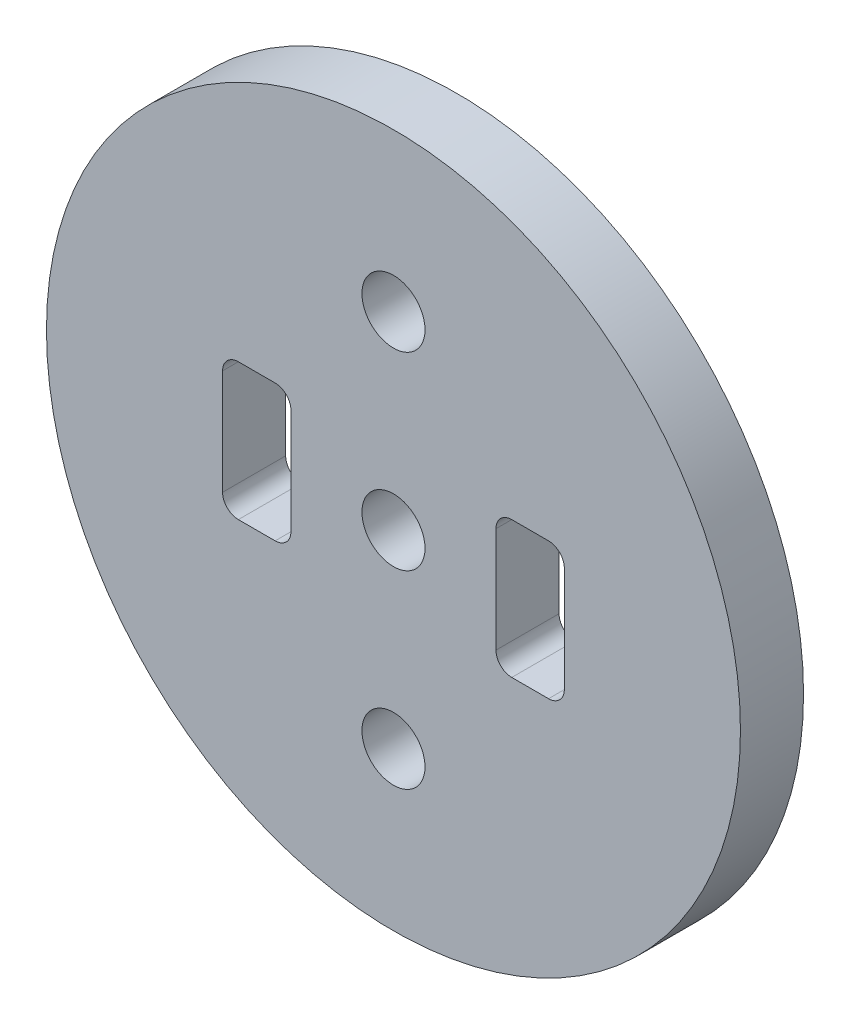
ISO-10303-21;
HEADER;
FILE_DESCRIPTION(('STEP AP214'),'2;1');
FILE_NAME('part.step','',(''),(''),'','','');
FILE_SCHEMA(('AUTOMOTIVE_DESIGN { 1 0 10303 214 1 1 1 1 }'));
ENDSEC;
DATA;
#1=APPLICATION_CONTEXT('core data for automotive mechanical design processes');
#2=APPLICATION_PROTOCOL_DEFINITION('international standard','automotive_design',2000,#1);
#3=PRODUCT_CONTEXT('',#1,'mechanical');
#4=PRODUCT('Part','Part','',(#3));
#5=PRODUCT_RELATED_PRODUCT_CATEGORY('part','',(#4));
#6=PRODUCT_DEFINITION_FORMATION('','',#4);
#7=PRODUCT_DEFINITION_CONTEXT('part definition',#1,'design');
#8=PRODUCT_DEFINITION('design','',#6,#7);
#9=PRODUCT_DEFINITION_SHAPE('','',#8);
#10=(LENGTH_UNIT() NAMED_UNIT(*) SI_UNIT(.MILLI.,.METRE.));
#11=(NAMED_UNIT(*) PLANE_ANGLE_UNIT() SI_UNIT($,.RADIAN.));
#12=(NAMED_UNIT(*) SI_UNIT($,.STERADIAN.) SOLID_ANGLE_UNIT());
#13=UNCERTAINTY_MEASURE_WITH_UNIT(LENGTH_MEASURE(1.E-05),#10,'distance_accuracy_value','');
#14=(GEOMETRIC_REPRESENTATION_CONTEXT(3) GLOBAL_UNCERTAINTY_ASSIGNED_CONTEXT((#13)) GLOBAL_UNIT_ASSIGNED_CONTEXT((#10,
#11,#12)) REPRESENTATION_CONTEXT('',''));
#15=CARTESIAN_POINT('',(0.,0.,0.));
#16=DIRECTION('',(0.,0.,1.));
#17=DIRECTION('',(1.,0.,0.));
#18=AXIS2_PLACEMENT_3D('',#15,#16,#17);
#19=CARTESIAN_POINT('',(215.7478079135,241.9520199932,3.));
#20=DIRECTION('',(0.,0.,1.));
#21=DIRECTION('',(1.,0.,0.));
#22=AXIS2_PLACEMENT_3D('',#19,#20,#21);
#23=PLANE('',#22);
#24=DIRECTION('',(0.,-1.,0.));
#25=VECTOR('',#24,1.);
#26=CARTESIAN_POINT('',(220.6228079135,244.4520199932,3.));
#27=LINE('',#26,#25);
#28=CARTESIAN_POINT('',(220.6228079135,244.4520199932,3.));
#29=VERTEX_POINT('',#28);
#30=CARTESIAN_POINT('',(220.6228079135,239.4520199932,3.));
#31=VERTEX_POINT('',#30);
#32=EDGE_CURVE('E213',#29,#31,#27,.T.);
#33=ORIENTED_EDGE('',*,*,#32,.F.);
#34=CARTESIAN_POINT('',(221.3728079135,244.4520199932,3.));
#35=DIRECTION('',(0.,0.,1.));
#36=DIRECTION('',(1.,0.,0.));
#37=AXIS2_PLACEMENT_3D('',#34,#35,#36);
#38=CIRCLE('',#37,0.750000000000001);
#39=CARTESIAN_POINT('',(221.3728079135,245.2020199932,3.));
#40=VERTEX_POINT('',#39);
#41=EDGE_CURVE('E211',#40,#29,#38,.T.);
#42=ORIENTED_EDGE('',*,*,#41,.F.);
#43=DIRECTION('',(-1.,0.,0.));
#44=VECTOR('',#43,1.);
#45=CARTESIAN_POINT('',(223.1228079135,245.2020199932,3.));
#46=LINE('',#45,#44);
#47=CARTESIAN_POINT('',(223.1228079135,245.2020199932,3.));
#48=VERTEX_POINT('',#47);
#49=EDGE_CURVE('E227',#48,#40,#46,.T.);
#50=ORIENTED_EDGE('',*,*,#49,.F.);
#51=CARTESIAN_POINT('',(223.1228079135,244.4520199932,3.));
#52=DIRECTION('',(0.,0.,1.));
#53=DIRECTION('',(1.,0.,0.));
#54=AXIS2_PLACEMENT_3D('',#51,#52,#53);
#55=CIRCLE('',#54,0.750000000000001);
#56=CARTESIAN_POINT('',(223.8728079135,244.4520199932,3.));
#57=VERTEX_POINT('',#56);
#58=EDGE_CURVE('E224',#57,#48,#55,.T.);
#59=ORIENTED_EDGE('',*,*,#58,.F.);
#60=DIRECTION('',(0.,1.,0.));
#61=VECTOR('',#60,1.);
#62=CARTESIAN_POINT('',(223.8728079135,239.4520199932,3.));
#63=LINE('',#62,#61);
#64=CARTESIAN_POINT('',(223.8728079135,239.4520199932,3.));
#65=VERTEX_POINT('',#64);
#66=EDGE_CURVE('E222',#65,#57,#63,.T.);
#67=ORIENTED_EDGE('',*,*,#66,.F.);
#68=CARTESIAN_POINT('',(223.1228079135,239.4520199932,3.));
#69=DIRECTION('',(0.,0.,1.));
#70=DIRECTION('',(1.,0.,0.));
#71=AXIS2_PLACEMENT_3D('',#68,#69,#70);
#72=CIRCLE('',#71,0.750000000000001);
#73=CARTESIAN_POINT('',(223.1228079135,238.7020199932,3.));
#74=VERTEX_POINT('',#73);
#75=EDGE_CURVE('E220',#74,#65,#72,.T.);
#76=ORIENTED_EDGE('',*,*,#75,.F.);
#77=DIRECTION('',(1.,0.,0.));
#78=VECTOR('',#77,1.);
#79=CARTESIAN_POINT('',(221.3728079135,238.7020199932,3.));
#80=LINE('',#79,#78);
#81=CARTESIAN_POINT('',(221.3728079135,238.7020199932,3.));
#82=VERTEX_POINT('',#81);
#83=EDGE_CURVE('E218',#82,#74,#80,.T.);
#84=ORIENTED_EDGE('',*,*,#83,.F.);
#85=CARTESIAN_POINT('',(221.3728079135,239.4520199932,3.));
#86=DIRECTION('',(0.,0.,1.));
#87=DIRECTION('',(1.,0.,0.));
#88=AXIS2_PLACEMENT_3D('',#85,#86,#87);
#89=CIRCLE('',#88,0.750000000000001);
#90=EDGE_CURVE('E216',#31,#82,#89,.T.);
#91=ORIENTED_EDGE('',*,*,#90,.F.);
#92=EDGE_LOOP('',(#33,#42,#50,#59,#67,#76,#84,#91));
#93=FACE_BOUND('',#92,.T.);
#94=CARTESIAN_POINT('',(215.7478079135,232.9520199932,3.));
#95=DIRECTION('',(0.,0.,1.));
#96=DIRECTION('',(1.,0.,0.));
#97=AXIS2_PLACEMENT_3D('',#94,#95,#96);
#98=CIRCLE('',#97,1.5);
#99=CARTESIAN_POINT('',(217.2478079135,232.9520199932,3.));
#100=VERTEX_POINT('',#99);
#101=EDGE_CURVE('E276',#100,#100,#98,.T.);
#102=ORIENTED_EDGE('',*,*,#101,.F.);
#103=EDGE_LOOP('',(#102));
#104=FACE_BOUND('',#103,.T.);
#105=CARTESIAN_POINT('',(215.7478079135,241.9520199932,3.));
#106=DIRECTION('',(0.,0.,1.));
#107=DIRECTION('',(1.,0.,0.));
#108=AXIS2_PLACEMENT_3D('',#105,#106,#107);
#109=CIRCLE('',#108,16.5);
#110=CARTESIAN_POINT('',(232.2478079135,241.9520199932,3.));
#111=VERTEX_POINT('',#110);
#112=EDGE_CURVE('E11',#111,#111,#109,.T.);
#113=ORIENTED_EDGE('',*,*,#112,.T.);
#114=EDGE_LOOP('',(#113));
#115=FACE_BOUND('',#114,.T.);
#116=CARTESIAN_POINT('',(215.7478079135,241.9520199932,3.));
#117=DIRECTION('',(0.,0.,1.));
#118=DIRECTION('',(1.,0.,0.));
#119=AXIS2_PLACEMENT_3D('',#116,#117,#118);
#120=CIRCLE('',#119,1.5);
#121=CARTESIAN_POINT('',(217.2478079135,241.9520199932,3.));
#122=VERTEX_POINT('',#121);
#123=EDGE_CURVE('E282',#122,#122,#120,.T.);
#124=ORIENTED_EDGE('',*,*,#123,.F.);
#125=EDGE_LOOP('',(#124));
#126=FACE_BOUND('',#125,.T.);
#127=CARTESIAN_POINT('',(215.7478079135,250.9520199932,3.));
#128=DIRECTION('',(0.,0.,1.));
#129=DIRECTION('',(1.,0.,0.));
#130=AXIS2_PLACEMENT_3D('',#127,#128,#129);
#131=CIRCLE('',#130,1.5);
#132=CARTESIAN_POINT('',(217.2478079135,250.9520199932,3.));
#133=VERTEX_POINT('',#132);
#134=EDGE_CURVE('E270',#133,#133,#131,.T.);
#135=ORIENTED_EDGE('',*,*,#134,.F.);
#136=EDGE_LOOP('',(#135));
#137=FACE_BOUND('',#136,.T.);
#138=DIRECTION('',(-1.,0.,0.));
#139=VECTOR('',#138,1.);
#140=CARTESIAN_POINT('',(208.3728079135,245.2020199932,3.));
#141=LINE('',#140,#139);
#142=CARTESIAN_POINT('',(210.1228079135,245.2020199932,3.));
#143=VERTEX_POINT('',#142);
#144=CARTESIAN_POINT('',(208.3728079135,245.2020199932,3.));
#145=VERTEX_POINT('',#144);
#146=EDGE_CURVE('E154',#143,#145,#141,.T.);
#147=ORIENTED_EDGE('',*,*,#146,.F.);
#148=CARTESIAN_POINT('',(210.1228079135,244.4520199932,3.));
#149=DIRECTION('',(0.,0.,1.));
#150=DIRECTION('',(1.,0.,0.));
#151=AXIS2_PLACEMENT_3D('',#148,#149,#150);
#152=CIRCLE('',#151,0.750000000000001);
#153=CARTESIAN_POINT('',(210.8728079135,244.4520199932,3.));
#154=VERTEX_POINT('',#153);
#155=EDGE_CURVE('E146',#154,#143,#152,.T.);
#156=ORIENTED_EDGE('',*,*,#155,.F.);
#157=DIRECTION('',(0.,1.,0.));
#158=VECTOR('',#157,1.);
#159=CARTESIAN_POINT('',(210.8728079135,244.4520199932,3.));
#160=LINE('',#159,#158);
#161=CARTESIAN_POINT('',(210.8728079135,239.4520199932,3.));
#162=VERTEX_POINT('',#161);
#163=EDGE_CURVE('E179',#162,#154,#160,.T.);
#164=ORIENTED_EDGE('',*,*,#163,.F.);
#165=CARTESIAN_POINT('',(210.1228079135,239.4520199932,3.));
#166=DIRECTION('',(0.,0.,1.));
#167=DIRECTION('',(1.,0.,0.));
#168=AXIS2_PLACEMENT_3D('',#165,#166,#167);
#169=CIRCLE('',#168,0.750000000000001);
#170=CARTESIAN_POINT('',(210.1228079135,238.7020199932,3.));
#171=VERTEX_POINT('',#170);
#172=EDGE_CURVE('E177',#171,#162,#169,.T.);
#173=ORIENTED_EDGE('',*,*,#172,.F.);
#174=DIRECTION('',(1.,0.,0.));
#175=VECTOR('',#174,1.);
#176=CARTESIAN_POINT('',(210.1228079135,238.7020199932,3.));
#177=LINE('',#176,#175);
#178=CARTESIAN_POINT('',(208.3728079135,238.7020199932,3.));
#179=VERTEX_POINT('',#178);
#180=EDGE_CURVE('E175',#179,#171,#177,.T.);
#181=ORIENTED_EDGE('',*,*,#180,.F.);
#182=CARTESIAN_POINT('',(208.3728079135,239.4520199932,3.));
#183=DIRECTION('',(0.,0.,1.));
#184=DIRECTION('',(1.,0.,0.));
#185=AXIS2_PLACEMENT_3D('',#182,#183,#184);
#186=CIRCLE('',#185,0.750000000000237);
#187=CARTESIAN_POINT('',(207.6228079135,239.4520199932,3.));
#188=VERTEX_POINT('',#187);
#189=EDGE_CURVE('E173',#188,#179,#186,.T.);
#190=ORIENTED_EDGE('',*,*,#189,.F.);
#191=DIRECTION('',(0.,-1.,0.));
#192=VECTOR('',#191,1.);
#193=CARTESIAN_POINT('',(207.6228079135,239.4520199932,3.));
#194=LINE('',#193,#192);
#195=CARTESIAN_POINT('',(207.6228079135,244.4520199932,3.));
#196=VERTEX_POINT('',#195);
#197=EDGE_CURVE('E169',#196,#188,#194,.T.);
#198=ORIENTED_EDGE('',*,*,#197,.F.);
#199=CARTESIAN_POINT('',(208.3728079135,244.4520199932,3.));
#200=DIRECTION('',(0.,0.,1.));
#201=DIRECTION('',(1.,0.,0.));
#202=AXIS2_PLACEMENT_3D('',#199,#200,#201);
#203=CIRCLE('',#202,0.750000000000001);
#204=EDGE_CURVE('E167',#145,#196,#203,.T.);
#205=ORIENTED_EDGE('',*,*,#204,.F.);
#206=EDGE_LOOP('',(#147,#156,#164,#173,#181,#190,#198,#205));
#207=FACE_BOUND('',#206,.T.);
#208=ADVANCED_FACE('F33',(#93,#104,#115,#126,#137,#207),#23,.T.);
#209=CARTESIAN_POINT('',(215.7478079135,241.9520199932,0.));
#210=DIRECTION('',(0.,0.,1.));
#211=DIRECTION('',(1.,0.,0.));
#212=AXIS2_PLACEMENT_3D('',#209,#210,#211);
#213=PLANE('',#212);
#214=CARTESIAN_POINT('',(221.3728079135,244.4520199932,0.));
#215=DIRECTION('',(0.,0.,1.));
#216=DIRECTION('',(1.,0.,0.));
#217=AXIS2_PLACEMENT_3D('',#214,#215,#216);
#218=CIRCLE('',#217,0.750000000000001);
#219=CARTESIAN_POINT('',(221.3728079135,245.2020199932,0.));
#220=VERTEX_POINT('',#219);
#221=CARTESIAN_POINT('',(220.6228079135,244.4520199932,0.));
#222=VERTEX_POINT('',#221);
#223=EDGE_CURVE('E162',#220,#222,#218,.T.);
#224=ORIENTED_EDGE('',*,*,#223,.T.);
#225=DIRECTION('',(0.,-1.,0.));
#226=VECTOR('',#225,1.);
#227=CARTESIAN_POINT('',(220.6228079135,244.4520199932,0.));
#228=LINE('',#227,#226);
#229=CARTESIAN_POINT('',(220.6228079135,239.4520199932,0.));
#230=VERTEX_POINT('',#229);
#231=EDGE_CURVE('E232',#222,#230,#228,.T.);
#232=ORIENTED_EDGE('',*,*,#231,.T.);
#233=CARTESIAN_POINT('',(221.3728079135,239.4520199932,0.));
#234=DIRECTION('',(0.,0.,1.));
#235=DIRECTION('',(1.,0.,0.));
#236=AXIS2_PLACEMENT_3D('',#233,#234,#235);
#237=CIRCLE('',#236,0.750000000000001);
#238=CARTESIAN_POINT('',(221.3728079135,238.7020199932,0.));
#239=VERTEX_POINT('',#238);
#240=EDGE_CURVE('E235',#230,#239,#237,.T.);
#241=ORIENTED_EDGE('',*,*,#240,.T.);
#242=DIRECTION('',(1.,0.,0.));
#243=VECTOR('',#242,1.);
#244=CARTESIAN_POINT('',(221.3728079135,238.7020199932,0.));
#245=LINE('',#244,#243);
#246=CARTESIAN_POINT('',(223.1228079135,238.7020199932,0.));
#247=VERTEX_POINT('',#246);
#248=EDGE_CURVE('E238',#239,#247,#245,.T.);
#249=ORIENTED_EDGE('',*,*,#248,.T.);
#250=CARTESIAN_POINT('',(223.1228079135,239.4520199932,0.));
#251=DIRECTION('',(0.,0.,1.));
#252=DIRECTION('',(1.,0.,0.));
#253=AXIS2_PLACEMENT_3D('',#250,#251,#252);
#254=CIRCLE('',#253,0.750000000000001);
#255=CARTESIAN_POINT('',(223.8728079135,239.4520199932,0.));
#256=VERTEX_POINT('',#255);
#257=EDGE_CURVE('E241',#247,#256,#254,.T.);
#258=ORIENTED_EDGE('',*,*,#257,.T.);
#259=DIRECTION('',(0.,1.,0.));
#260=VECTOR('',#259,1.);
#261=CARTESIAN_POINT('',(223.8728079135,239.4520199932,0.));
#262=LINE('',#261,#260);
#263=CARTESIAN_POINT('',(223.8728079135,244.4520199932,0.));
#264=VERTEX_POINT('',#263);
#265=EDGE_CURVE('E244',#256,#264,#262,.T.);
#266=ORIENTED_EDGE('',*,*,#265,.T.);
#267=CARTESIAN_POINT('',(223.1228079135,244.4520199932,0.));
#268=DIRECTION('',(0.,0.,1.));
#269=DIRECTION('',(1.,0.,0.));
#270=AXIS2_PLACEMENT_3D('',#267,#268,#269);
#271=CIRCLE('',#270,0.750000000000001);
#272=CARTESIAN_POINT('',(223.1228079135,245.2020199932,0.));
#273=VERTEX_POINT('',#272);
#274=EDGE_CURVE('E247',#264,#273,#271,.T.);
#275=ORIENTED_EDGE('',*,*,#274,.T.);
#276=DIRECTION('',(-1.,0.,0.));
#277=VECTOR('',#276,1.);
#278=CARTESIAN_POINT('',(223.1228079135,245.2020199932,0.));
#279=LINE('',#278,#277);
#280=EDGE_CURVE('E214',#273,#220,#279,.T.);
#281=ORIENTED_EDGE('',*,*,#280,.T.);
#282=EDGE_LOOP('',(#224,#232,#241,#249,#258,#266,#275,#281));
#283=FACE_BOUND('',#282,.T.);
#284=CARTESIAN_POINT('',(215.7478079135,232.9520199932,0.));
#285=DIRECTION('',(0.,0.,1.));
#286=DIRECTION('',(1.,0.,0.));
#287=AXIS2_PLACEMENT_3D('',#284,#285,#286);
#288=CIRCLE('',#287,1.5);
#289=CARTESIAN_POINT('',(217.2478079135,232.9520199932,0.));
#290=VERTEX_POINT('',#289);
#291=EDGE_CURVE('E273',#290,#290,#288,.T.);
#292=ORIENTED_EDGE('',*,*,#291,.T.);
#293=EDGE_LOOP('',(#292));
#294=FACE_BOUND('',#293,.T.);
#295=CARTESIAN_POINT('',(215.7478079135,241.9520199932,0.));
#296=DIRECTION('',(0.,0.,1.));
#297=DIRECTION('',(1.,0.,0.));
#298=AXIS2_PLACEMENT_3D('',#295,#296,#297);
#299=CIRCLE('',#298,16.5);
#300=CARTESIAN_POINT('',(232.2478079135,241.9520199932,0.));
#301=VERTEX_POINT('',#300);
#302=EDGE_CURVE('E37',#301,#301,#299,.T.);
#303=ORIENTED_EDGE('',*,*,#302,.F.);
#304=EDGE_LOOP('',(#303));
#305=FACE_BOUND('',#304,.T.);
#306=CARTESIAN_POINT('',(215.7478079135,241.9520199932,0.));
#307=DIRECTION('',(0.,0.,1.));
#308=DIRECTION('',(1.,0.,0.));
#309=AXIS2_PLACEMENT_3D('',#306,#307,#308);
#310=CIRCLE('',#309,1.5);
#311=CARTESIAN_POINT('',(217.2478079135,241.9520199932,0.));
#312=VERTEX_POINT('',#311);
#313=EDGE_CURVE('E279',#312,#312,#310,.T.);
#314=ORIENTED_EDGE('',*,*,#313,.T.);
#315=EDGE_LOOP('',(#314));
#316=FACE_BOUND('',#315,.T.);
#317=CARTESIAN_POINT('',(215.7478079135,250.9520199932,0.));
#318=DIRECTION('',(0.,0.,1.));
#319=DIRECTION('',(1.,0.,0.));
#320=AXIS2_PLACEMENT_3D('',#317,#318,#319);
#321=CIRCLE('',#320,1.5);
#322=CARTESIAN_POINT('',(217.2478079135,250.9520199932,0.));
#323=VERTEX_POINT('',#322);
#324=EDGE_CURVE('E269',#323,#323,#321,.T.);
#325=ORIENTED_EDGE('',*,*,#324,.T.);
#326=EDGE_LOOP('',(#325));
#327=FACE_BOUND('',#326,.T.);
#328=CARTESIAN_POINT('',(210.1228079135,244.4520199932,0.));
#329=DIRECTION('',(0.,0.,1.));
#330=DIRECTION('',(1.,0.,0.));
#331=AXIS2_PLACEMENT_3D('',#328,#329,#330);
#332=CIRCLE('',#331,0.750000000000001);
#333=CARTESIAN_POINT('',(210.8728079135,244.4520199932,0.));
#334=VERTEX_POINT('',#333);
#335=CARTESIAN_POINT('',(210.1228079135,245.2020199932,0.));
#336=VERTEX_POINT('',#335);
#337=EDGE_CURVE('E56',#334,#336,#332,.T.);
#338=ORIENTED_EDGE('',*,*,#337,.T.);
#339=DIRECTION('',(-1.,0.,0.));
#340=VECTOR('',#339,1.);
#341=CARTESIAN_POINT('',(208.3728079135,245.2020199932,0.));
#342=LINE('',#341,#340);
#343=CARTESIAN_POINT('',(208.3728079135,245.2020199932,0.));
#344=VERTEX_POINT('',#343);
#345=EDGE_CURVE('E161',#336,#344,#342,.T.);
#346=ORIENTED_EDGE('',*,*,#345,.T.);
#347=CARTESIAN_POINT('',(208.3728079135,244.4520199932,0.));
#348=DIRECTION('',(0.,0.,1.));
#349=DIRECTION('',(1.,0.,0.));
#350=AXIS2_PLACEMENT_3D('',#347,#348,#349);
#351=CIRCLE('',#350,0.750000000000001);
#352=CARTESIAN_POINT('',(207.6228079135,244.4520199932,0.));
#353=VERTEX_POINT('',#352);
#354=EDGE_CURVE('E183',#344,#353,#351,.T.);
#355=ORIENTED_EDGE('',*,*,#354,.T.);
#356=DIRECTION('',(0.,-1.,0.));
#357=VECTOR('',#356,1.);
#358=CARTESIAN_POINT('',(207.6228079135,239.4520199932,0.));
#359=LINE('',#358,#357);
#360=CARTESIAN_POINT('',(207.6228079135,239.4520199932,0.));
#361=VERTEX_POINT('',#360);
#362=EDGE_CURVE('E186',#353,#361,#359,.T.);
#363=ORIENTED_EDGE('',*,*,#362,.T.);
#364=CARTESIAN_POINT('',(208.3728079135,239.4520199932,0.));
#365=DIRECTION('',(0.,0.,1.));
#366=DIRECTION('',(1.,0.,0.));
#367=AXIS2_PLACEMENT_3D('',#364,#365,#366);
#368=CIRCLE('',#367,0.750000000000237);
#369=CARTESIAN_POINT('',(208.3728079135,238.7020199932,0.));
#370=VERTEX_POINT('',#369);
#371=EDGE_CURVE('E189',#361,#370,#368,.T.);
#372=ORIENTED_EDGE('',*,*,#371,.T.);
#373=DIRECTION('',(1.,0.,0.));
#374=VECTOR('',#373,1.);
#375=CARTESIAN_POINT('',(210.1228079135,238.7020199932,0.));
#376=LINE('',#375,#374);
#377=CARTESIAN_POINT('',(210.1228079135,238.7020199932,0.));
#378=VERTEX_POINT('',#377);
#379=EDGE_CURVE('E192',#370,#378,#376,.T.);
#380=ORIENTED_EDGE('',*,*,#379,.T.);
#381=CARTESIAN_POINT('',(210.1228079135,239.4520199932,0.));
#382=DIRECTION('',(0.,0.,1.));
#383=DIRECTION('',(1.,0.,0.));
#384=AXIS2_PLACEMENT_3D('',#381,#382,#383);
#385=CIRCLE('',#384,0.750000000000001);
#386=CARTESIAN_POINT('',(210.8728079135,239.4520199932,0.));
#387=VERTEX_POINT('',#386);
#388=EDGE_CURVE('E195',#378,#387,#385,.T.);
#389=ORIENTED_EDGE('',*,*,#388,.T.);
#390=DIRECTION('',(0.,1.,0.));
#391=VECTOR('',#390,1.);
#392=CARTESIAN_POINT('',(210.8728079135,244.4520199932,0.));
#393=LINE('',#392,#391);
#394=EDGE_CURVE('E155',#387,#334,#393,.T.);
#395=ORIENTED_EDGE('',*,*,#394,.T.);
#396=EDGE_LOOP('',(#338,#346,#355,#363,#372,#380,#389,#395));
#397=FACE_BOUND('',#396,.T.);
#398=ADVANCED_FACE('F288',(#283,#294,#305,#316,#327,#397),#213,.F.);
#399=CARTESIAN_POINT('',(215.7478079135,241.9520199932,3.));
#400=DIRECTION('',(0.,0.,-1.));
#401=DIRECTION('',(-1.,0.,0.));
#402=AXIS2_PLACEMENT_3D('',#399,#400,#401);
#403=CYLINDRICAL_SURFACE('',#402,16.5);
#404=ORIENTED_EDGE('',*,*,#112,.F.);
#405=EDGE_LOOP('',(#404));
#406=FACE_BOUND('',#405,.T.);
#407=ORIENTED_EDGE('',*,*,#302,.T.);
#408=EDGE_LOOP('',(#407));
#409=FACE_BOUND('',#408,.T.);
#410=ADVANCED_FACE('F35',(#406,#409),#403,.T.);
#411=CARTESIAN_POINT('',(215.7478079135,241.9520199932,3.));
#412=DIRECTION('',(0.,0.,-1.));
#413=DIRECTION('',(-1.,0.,0.));
#414=AXIS2_PLACEMENT_3D('',#411,#412,#413);
#415=CYLINDRICAL_SURFACE('',#414,1.5);
#416=ORIENTED_EDGE('',*,*,#123,.T.);
#417=EDGE_LOOP('',(#416));
#418=FACE_BOUND('',#417,.T.);
#419=ORIENTED_EDGE('',*,*,#313,.F.);
#420=EDGE_LOOP('',(#419));
#421=FACE_BOUND('',#420,.T.);
#422=ADVANCED_FACE('F291',(#418,#421),#415,.F.);
#423=CARTESIAN_POINT('',(215.7478079135,232.9520199932,3.));
#424=DIRECTION('',(0.,0.,-1.));
#425=DIRECTION('',(-1.,0.,0.));
#426=AXIS2_PLACEMENT_3D('',#423,#424,#425);
#427=CYLINDRICAL_SURFACE('',#426,1.5);
#428=ORIENTED_EDGE('',*,*,#101,.T.);
#429=EDGE_LOOP('',(#428));
#430=FACE_BOUND('',#429,.T.);
#431=ORIENTED_EDGE('',*,*,#291,.F.);
#432=EDGE_LOOP('',(#431));
#433=FACE_BOUND('',#432,.T.);
#434=ADVANCED_FACE('F293',(#430,#433),#427,.F.);
#435=CARTESIAN_POINT('',(215.7478079135,250.9520199932,3.));
#436=DIRECTION('',(0.,0.,-1.));
#437=DIRECTION('',(-1.,0.,0.));
#438=AXIS2_PLACEMENT_3D('',#435,#436,#437);
#439=CYLINDRICAL_SURFACE('',#438,1.5);
#440=ORIENTED_EDGE('',*,*,#134,.T.);
#441=EDGE_LOOP('',(#440));
#442=FACE_BOUND('',#441,.T.);
#443=ORIENTED_EDGE('',*,*,#324,.F.);
#444=EDGE_LOOP('',(#443));
#445=FACE_BOUND('',#444,.T.);
#446=ADVANCED_FACE('F300',(#442,#445),#439,.F.);
#447=CARTESIAN_POINT('',(221.3728079135,244.4520199932,3.));
#448=DIRECTION('',(0.,0.,-1.));
#449=DIRECTION('',(-1.,0.,0.));
#450=AXIS2_PLACEMENT_3D('',#447,#448,#449);
#451=CYLINDRICAL_SURFACE('',#450,0.750000000000001);
#452=ORIENTED_EDGE('',*,*,#223,.F.);
#453=DIRECTION('',(0.,0.,-1.));
#454=VECTOR('',#453,1.);
#455=CARTESIAN_POINT('',(221.3728079135,245.2020199932,3.));
#456=LINE('',#455,#454);
#457=EDGE_CURVE('E229',#40,#220,#456,.T.);
#458=ORIENTED_EDGE('',*,*,#457,.F.);
#459=ORIENTED_EDGE('',*,*,#41,.T.);
#460=DIRECTION('',(0.,0.,-1.));
#461=VECTOR('',#460,1.);
#462=CARTESIAN_POINT('',(220.6228079135,244.4520199932,3.));
#463=LINE('',#462,#461);
#464=EDGE_CURVE('E266',#29,#222,#463,.T.);
#465=ORIENTED_EDGE('',*,*,#464,.T.);
#466=EDGE_LOOP('',(#452,#458,#459,#465));
#467=FACE_BOUND('',#466,.T.);
#468=ADVANCED_FACE('F325',(#467),#451,.F.);
#469=CARTESIAN_POINT('',(220.6228079135,244.4520199932,3.));
#470=DIRECTION('',(1.,0.,0.));
#471=DIRECTION('',(0.,0.,-1.));
#472=AXIS2_PLACEMENT_3D('',#469,#470,#471);
#473=PLANE('',#472);
#474=ORIENTED_EDGE('',*,*,#231,.F.);
#475=ORIENTED_EDGE('',*,*,#464,.F.);
#476=ORIENTED_EDGE('',*,*,#32,.T.);
#477=DIRECTION('',(0.,0.,-1.));
#478=VECTOR('',#477,1.);
#479=CARTESIAN_POINT('',(220.6228079135,239.4520199932,3.));
#480=LINE('',#479,#478);
#481=EDGE_CURVE('E264',#31,#230,#480,.T.);
#482=ORIENTED_EDGE('',*,*,#481,.T.);
#483=EDGE_LOOP('',(#474,#475,#476,#482));
#484=FACE_BOUND('',#483,.T.);
#485=ADVANCED_FACE('F387',(#484),#473,.T.);
#486=CARTESIAN_POINT('',(221.3728079135,239.4520199932,3.));
#487=DIRECTION('',(0.,0.,-1.));
#488=DIRECTION('',(-1.,0.,0.));
#489=AXIS2_PLACEMENT_3D('',#486,#487,#488);
#490=CYLINDRICAL_SURFACE('',#489,0.750000000000001);
#491=ORIENTED_EDGE('',*,*,#240,.F.);
#492=ORIENTED_EDGE('',*,*,#481,.F.);
#493=ORIENTED_EDGE('',*,*,#90,.T.);
#494=DIRECTION('',(0.,0.,-1.));
#495=VECTOR('',#494,1.);
#496=CARTESIAN_POINT('',(221.3728079135,238.7020199932,3.));
#497=LINE('',#496,#495);
#498=EDGE_CURVE('E262',#82,#239,#497,.T.);
#499=ORIENTED_EDGE('',*,*,#498,.T.);
#500=EDGE_LOOP('',(#491,#492,#493,#499));
#501=FACE_BOUND('',#500,.T.);
#502=ADVANCED_FACE('F383',(#501),#490,.F.);
#503=CARTESIAN_POINT('',(221.3728079135,238.7020199932,3.));
#504=DIRECTION('',(0.,1.,0.));
#505=DIRECTION('',(0.,0.,1.));
#506=AXIS2_PLACEMENT_3D('',#503,#504,#505);
#507=PLANE('',#506);
#508=ORIENTED_EDGE('',*,*,#248,.F.);
#509=ORIENTED_EDGE('',*,*,#498,.F.);
#510=ORIENTED_EDGE('',*,*,#83,.T.);
#511=DIRECTION('',(0.,0.,-1.));
#512=VECTOR('',#511,1.);
#513=CARTESIAN_POINT('',(223.1228079135,238.7020199932,3.));
#514=LINE('',#513,#512);
#515=EDGE_CURVE('E260',#74,#247,#514,.T.);
#516=ORIENTED_EDGE('',*,*,#515,.T.);
#517=EDGE_LOOP('',(#508,#509,#510,#516));
#518=FACE_BOUND('',#517,.T.);
#519=ADVANCED_FACE('F379',(#518),#507,.T.);
#520=CARTESIAN_POINT('',(223.1228079135,239.4520199932,3.));
#521=DIRECTION('',(0.,0.,-1.));
#522=DIRECTION('',(-1.,0.,0.));
#523=AXIS2_PLACEMENT_3D('',#520,#521,#522);
#524=CYLINDRICAL_SURFACE('',#523,0.750000000000001);
#525=ORIENTED_EDGE('',*,*,#257,.F.);
#526=ORIENTED_EDGE('',*,*,#515,.F.);
#527=ORIENTED_EDGE('',*,*,#75,.T.);
#528=DIRECTION('',(0.,0.,-1.));
#529=VECTOR('',#528,1.);
#530=CARTESIAN_POINT('',(223.8728079135,239.4520199932,3.));
#531=LINE('',#530,#529);
#532=EDGE_CURVE('E258',#65,#256,#531,.T.);
#533=ORIENTED_EDGE('',*,*,#532,.T.);
#534=EDGE_LOOP('',(#525,#526,#527,#533));
#535=FACE_BOUND('',#534,.T.);
#536=ADVANCED_FACE('F375',(#535),#524,.F.);
#537=CARTESIAN_POINT('',(223.8728079135,239.4520199932,3.));
#538=DIRECTION('',(-1.,0.,0.));
#539=DIRECTION('',(0.,0.,1.));
#540=AXIS2_PLACEMENT_3D('',#537,#538,#539);
#541=PLANE('',#540);
#542=ORIENTED_EDGE('',*,*,#265,.F.);
#543=ORIENTED_EDGE('',*,*,#532,.F.);
#544=ORIENTED_EDGE('',*,*,#66,.T.);
#545=DIRECTION('',(0.,0.,-1.));
#546=VECTOR('',#545,1.);
#547=CARTESIAN_POINT('',(223.8728079135,244.4520199932,3.));
#548=LINE('',#547,#546);
#549=EDGE_CURVE('E256',#57,#264,#548,.T.);
#550=ORIENTED_EDGE('',*,*,#549,.T.);
#551=EDGE_LOOP('',(#542,#543,#544,#550));
#552=FACE_BOUND('',#551,.T.);
#553=ADVANCED_FACE('F371',(#552),#541,.T.);
#554=CARTESIAN_POINT('',(223.1228079135,244.4520199932,3.));
#555=DIRECTION('',(0.,0.,-1.));
#556=DIRECTION('',(-1.,0.,0.));
#557=AXIS2_PLACEMENT_3D('',#554,#555,#556);
#558=CYLINDRICAL_SURFACE('',#557,0.750000000000001);
#559=ORIENTED_EDGE('',*,*,#274,.F.);
#560=ORIENTED_EDGE('',*,*,#549,.F.);
#561=ORIENTED_EDGE('',*,*,#58,.T.);
#562=DIRECTION('',(0.,0.,-1.));
#563=VECTOR('',#562,1.);
#564=CARTESIAN_POINT('',(223.1228079135,245.2020199932,3.));
#565=LINE('',#564,#563);
#566=EDGE_CURVE('E254',#48,#273,#565,.T.);
#567=ORIENTED_EDGE('',*,*,#566,.T.);
#568=EDGE_LOOP('',(#559,#560,#561,#567));
#569=FACE_BOUND('',#568,.T.);
#570=ADVANCED_FACE('F367',(#569),#558,.F.);
#571=CARTESIAN_POINT('',(223.1228079135,245.2020199932,3.));
#572=DIRECTION('',(0.,-1.,0.));
#573=DIRECTION('',(0.,0.,-1.));
#574=AXIS2_PLACEMENT_3D('',#571,#572,#573);
#575=PLANE('',#574);
#576=ORIENTED_EDGE('',*,*,#280,.F.);
#577=ORIENTED_EDGE('',*,*,#566,.F.);
#578=ORIENTED_EDGE('',*,*,#49,.T.);
#579=ORIENTED_EDGE('',*,*,#457,.T.);
#580=EDGE_LOOP('',(#576,#577,#578,#579));
#581=FACE_BOUND('',#580,.T.);
#582=ADVANCED_FACE('F364',(#581),#575,.T.);
#583=CARTESIAN_POINT('',(210.1228079135,244.4520199932,3.));
#584=DIRECTION('',(0.,0.,-1.));
#585=DIRECTION('',(-1.,0.,0.));
#586=AXIS2_PLACEMENT_3D('',#583,#584,#585);
#587=CYLINDRICAL_SURFACE('',#586,0.750000000000001);
#588=ORIENTED_EDGE('',*,*,#337,.F.);
#589=DIRECTION('',(0.,0.,-1.));
#590=VECTOR('',#589,1.);
#591=CARTESIAN_POINT('',(210.8728079135,244.4520199932,3.));
#592=LINE('',#591,#590);
#593=EDGE_CURVE('E150',#154,#334,#592,.T.);
#594=ORIENTED_EDGE('',*,*,#593,.F.);
#595=ORIENTED_EDGE('',*,*,#155,.T.);
#596=DIRECTION('',(0.,0.,-1.));
#597=VECTOR('',#596,1.);
#598=CARTESIAN_POINT('',(210.1228079135,245.2020199932,3.));
#599=LINE('',#598,#597);
#600=EDGE_CURVE('E149',#143,#336,#599,.T.);
#601=ORIENTED_EDGE('',*,*,#600,.T.);
#602=EDGE_LOOP('',(#588,#594,#595,#601));
#603=FACE_BOUND('',#602,.T.);
#604=ADVANCED_FACE('F148',(#603),#587,.F.);
#605=CARTESIAN_POINT('',(208.3728079135,245.2020199932,3.));
#606=DIRECTION('',(0.,-1.,0.));
#607=DIRECTION('',(0.,0.,-1.));
#608=AXIS2_PLACEMENT_3D('',#605,#606,#607);
#609=PLANE('',#608);
#610=ORIENTED_EDGE('',*,*,#345,.F.);
#611=ORIENTED_EDGE('',*,*,#600,.F.);
#612=ORIENTED_EDGE('',*,*,#146,.T.);
#613=DIRECTION('',(0.,0.,-1.));
#614=VECTOR('',#613,1.);
#615=CARTESIAN_POINT('',(208.3728079135,245.2020199932,3.));
#616=LINE('',#615,#614);
#617=EDGE_CURVE('E163',#145,#344,#616,.T.);
#618=ORIENTED_EDGE('',*,*,#617,.T.);
#619=EDGE_LOOP('',(#610,#611,#612,#618));
#620=FACE_BOUND('',#619,.T.);
#621=ADVANCED_FACE('F158',(#620),#609,.T.);
#622=CARTESIAN_POINT('',(208.3728079135,244.4520199932,3.));
#623=DIRECTION('',(0.,0.,-1.));
#624=DIRECTION('',(-1.,0.,0.));
#625=AXIS2_PLACEMENT_3D('',#622,#623,#624);
#626=CYLINDRICAL_SURFACE('',#625,0.750000000000001);
#627=ORIENTED_EDGE('',*,*,#354,.F.);
#628=ORIENTED_EDGE('',*,*,#617,.F.);
#629=ORIENTED_EDGE('',*,*,#204,.T.);
#630=DIRECTION('',(0.,0.,-1.));
#631=VECTOR('',#630,1.);
#632=CARTESIAN_POINT('',(207.6228079135,244.4520199932,3.));
#633=LINE('',#632,#631);
#634=EDGE_CURVE('E208',#196,#353,#633,.T.);
#635=ORIENTED_EDGE('',*,*,#634,.T.);
#636=EDGE_LOOP('',(#627,#628,#629,#635));
#637=FACE_BOUND('',#636,.T.);
#638=ADVANCED_FACE('F351',(#637),#626,.F.);
#639=CARTESIAN_POINT('',(207.6228079135,239.4520199932,3.));
#640=DIRECTION('',(1.,0.,0.));
#641=DIRECTION('',(0.,0.,-1.));
#642=AXIS2_PLACEMENT_3D('',#639,#640,#641);
#643=PLANE('',#642);
#644=ORIENTED_EDGE('',*,*,#362,.F.);
#645=ORIENTED_EDGE('',*,*,#634,.F.);
#646=ORIENTED_EDGE('',*,*,#197,.T.);
#647=DIRECTION('',(0.,0.,-1.));
#648=VECTOR('',#647,1.);
#649=CARTESIAN_POINT('',(207.6228079135,239.4520199932,3.));
#650=LINE('',#649,#648);
#651=EDGE_CURVE('E206',#188,#361,#650,.T.);
#652=ORIENTED_EDGE('',*,*,#651,.T.);
#653=EDGE_LOOP('',(#644,#645,#646,#652));
#654=FACE_BOUND('',#653,.T.);
#655=ADVANCED_FACE('F348',(#654),#643,.T.);
#656=CARTESIAN_POINT('',(208.3728079135,239.4520199932,3.));
#657=DIRECTION('',(0.,0.,-1.));
#658=DIRECTION('',(-1.,0.,0.));
#659=AXIS2_PLACEMENT_3D('',#656,#657,#658);
#660=CYLINDRICAL_SURFACE('',#659,0.750000000000237);
#661=ORIENTED_EDGE('',*,*,#371,.F.);
#662=ORIENTED_EDGE('',*,*,#651,.F.);
#663=ORIENTED_EDGE('',*,*,#189,.T.);
#664=DIRECTION('',(0.,0.,-1.));
#665=VECTOR('',#664,1.);
#666=CARTESIAN_POINT('',(208.3728079135,238.7020199932,3.));
#667=LINE('',#666,#665);
#668=EDGE_CURVE('E204',#179,#370,#667,.T.);
#669=ORIENTED_EDGE('',*,*,#668,.T.);
#670=EDGE_LOOP('',(#661,#662,#663,#669));
#671=FACE_BOUND('',#670,.T.);
#672=ADVANCED_FACE('F343',(#671),#660,.F.);
#673=CARTESIAN_POINT('',(210.1228079135,238.7020199932,3.));
#674=DIRECTION('',(0.,1.,0.));
#675=DIRECTION('',(0.,0.,1.));
#676=AXIS2_PLACEMENT_3D('',#673,#674,#675);
#677=PLANE('',#676);
#678=ORIENTED_EDGE('',*,*,#379,.F.);
#679=ORIENTED_EDGE('',*,*,#668,.F.);
#680=ORIENTED_EDGE('',*,*,#180,.T.);
#681=DIRECTION('',(0.,0.,-1.));
#682=VECTOR('',#681,1.);
#683=CARTESIAN_POINT('',(210.1228079135,238.7020199932,3.));
#684=LINE('',#683,#682);
#685=EDGE_CURVE('E202',#171,#378,#684,.T.);
#686=ORIENTED_EDGE('',*,*,#685,.T.);
#687=EDGE_LOOP('',(#678,#679,#680,#686));
#688=FACE_BOUND('',#687,.T.);
#689=ADVANCED_FACE('F339',(#688),#677,.T.);
#690=CARTESIAN_POINT('',(210.1228079135,239.4520199932,3.));
#691=DIRECTION('',(0.,0.,-1.));
#692=DIRECTION('',(-1.,0.,0.));
#693=AXIS2_PLACEMENT_3D('',#690,#691,#692);
#694=CYLINDRICAL_SURFACE('',#693,0.750000000000001);
#695=ORIENTED_EDGE('',*,*,#388,.F.);
#696=ORIENTED_EDGE('',*,*,#685,.F.);
#697=ORIENTED_EDGE('',*,*,#172,.T.);
#698=DIRECTION('',(0.,0.,-1.));
#699=VECTOR('',#698,1.);
#700=CARTESIAN_POINT('',(210.8728079135,239.4520199932,3.));
#701=LINE('',#700,#699);
#702=EDGE_CURVE('E48',#162,#387,#701,.T.);
#703=ORIENTED_EDGE('',*,*,#702,.T.);
#704=EDGE_LOOP('',(#695,#696,#697,#703));
#705=FACE_BOUND('',#704,.T.);
#706=ADVANCED_FACE('F336',(#705),#694,.F.);
#707=CARTESIAN_POINT('',(210.8728079135,244.4520199932,3.));
#708=DIRECTION('',(-1.,0.,0.));
#709=DIRECTION('',(0.,0.,1.));
#710=AXIS2_PLACEMENT_3D('',#707,#708,#709);
#711=PLANE('',#710);
#712=ORIENTED_EDGE('',*,*,#394,.F.);
#713=ORIENTED_EDGE('',*,*,#702,.F.);
#714=ORIENTED_EDGE('',*,*,#163,.T.);
#715=ORIENTED_EDGE('',*,*,#593,.T.);
#716=EDGE_LOOP('',(#712,#713,#714,#715));
#717=FACE_BOUND('',#716,.T.);
#718=ADVANCED_FACE('F330',(#717),#711,.T.);
#719=CLOSED_SHELL('',(#208,#398,#410,#422,#434,#446,#468,#485,#502,#519,#536,#553,#570,#582,
#604,#621,#638,#655,#672,#689,#706,#718));
#720=MANIFOLD_SOLID_BREP('B2',#719);
#721=ADVANCED_BREP_SHAPE_REPRESENTATION('',(#18,#720),#14);
#722=SHAPE_DEFINITION_REPRESENTATION(#9,#721);
ENDSEC;
END-ISO-10303-21;
